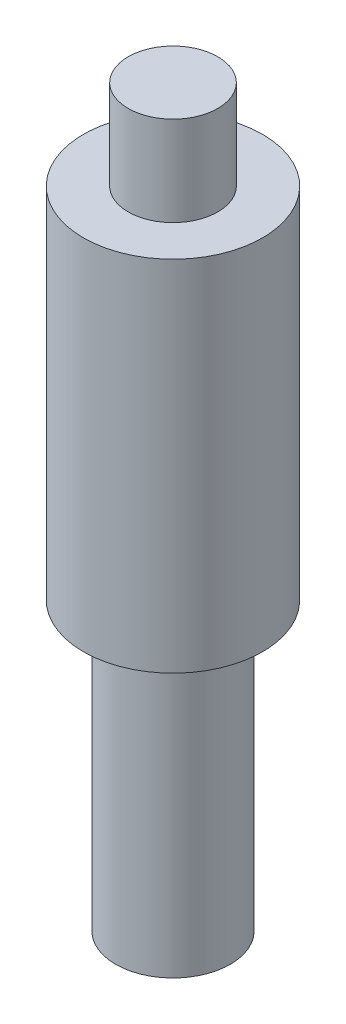
ISO-10303-21;
HEADER;
FILE_DESCRIPTION(('STEP AP214'),'2;1');
FILE_NAME('part.step','',(''),(''),'','','');
FILE_SCHEMA(('AUTOMOTIVE_DESIGN { 1 0 10303 214 1 1 1 1 }'));
ENDSEC;
DATA;
#1=APPLICATION_CONTEXT('core data for automotive mechanical design processes');
#2=APPLICATION_PROTOCOL_DEFINITION('international standard','automotive_design',2000,#1);
#3=PRODUCT_CONTEXT('',#1,'mechanical');
#4=PRODUCT('Part','Part','',(#3));
#5=PRODUCT_RELATED_PRODUCT_CATEGORY('part','',(#4));
#6=PRODUCT_DEFINITION_FORMATION('','',#4);
#7=PRODUCT_DEFINITION_CONTEXT('part definition',#1,'design');
#8=PRODUCT_DEFINITION('design','',#6,#7);
#9=PRODUCT_DEFINITION_SHAPE('','',#8);
#10=(LENGTH_UNIT() NAMED_UNIT(*) SI_UNIT(.MILLI.,.METRE.));
#11=(NAMED_UNIT(*) PLANE_ANGLE_UNIT() SI_UNIT($,.RADIAN.));
#12=(NAMED_UNIT(*) SI_UNIT($,.STERADIAN.) SOLID_ANGLE_UNIT());
#13=UNCERTAINTY_MEASURE_WITH_UNIT(LENGTH_MEASURE(1.E-05),#10,'distance_accuracy_value','');
#14=(GEOMETRIC_REPRESENTATION_CONTEXT(3) GLOBAL_UNCERTAINTY_ASSIGNED_CONTEXT((#13)) GLOBAL_UNIT_ASSIGNED_CONTEXT((#10,
#11,#12)) REPRESENTATION_CONTEXT('',''));
#15=CARTESIAN_POINT('',(0.,0.,0.));
#16=DIRECTION('',(0.,0.,1.));
#17=DIRECTION('',(1.,0.,0.));
#18=AXIS2_PLACEMENT_3D('',#15,#16,#17);
#19=CARTESIAN_POINT('',(0.,8.,0.));
#20=DIRECTION('',(0.,-1.,0.));
#21=DIRECTION('',(0.,0.,-1.));
#22=AXIS2_PLACEMENT_3D('',#19,#20,#21);
#23=CYLINDRICAL_SURFACE('',#22,1.6);
#24=CARTESIAN_POINT('',(0.,8.,0.));
#25=DIRECTION('',(0.,1.,0.));
#26=DIRECTION('',(0.,0.,1.));
#27=AXIS2_PLACEMENT_3D('',#24,#25,#26);
#28=CIRCLE('',#27,1.6);
#29=CARTESIAN_POINT('',(0.,8.,1.6));
#30=VERTEX_POINT('',#29);
#31=EDGE_CURVE('E51',#30,#30,#28,.T.);
#32=ORIENTED_EDGE('',*,*,#31,.F.);
#33=EDGE_LOOP('',(#32));
#34=FACE_BOUND('',#33,.T.);
#35=CARTESIAN_POINT('',(0.,0.,0.));
#36=DIRECTION('',(0.,1.,0.));
#37=DIRECTION('',(0.,0.,1.));
#38=AXIS2_PLACEMENT_3D('',#35,#36,#37);
#39=CIRCLE('',#38,1.6);
#40=CARTESIAN_POINT('',(0.,0.,1.6));
#41=VERTEX_POINT('',#40);
#42=EDGE_CURVE('E46',#41,#41,#39,.T.);
#43=ORIENTED_EDGE('',*,*,#42,.T.);
#44=EDGE_LOOP('',(#43));
#45=FACE_BOUND('',#44,.T.);
#46=ADVANCED_FACE('F43',(#34,#45),#23,.T.);
#47=CARTESIAN_POINT('',(0.,0.,0.));
#48=DIRECTION('',(0.,1.,0.));
#49=DIRECTION('',(0.,0.,1.));
#50=AXIS2_PLACEMENT_3D('',#47,#48,#49);
#51=PLANE('',#50);
#52=ORIENTED_EDGE('',*,*,#42,.F.);
#53=EDGE_LOOP('',(#52));
#54=FACE_BOUND('',#53,.T.);
#55=ADVANCED_FACE('F90',(#54),#51,.F.);
#56=CARTESIAN_POINT('',(0.,18.,0.));
#57=DIRECTION('',(0.,-1.,0.));
#58=DIRECTION('',(0.,0.,-1.));
#59=AXIS2_PLACEMENT_3D('',#56,#57,#58);
#60=CYLINDRICAL_SURFACE('',#59,2.5);
#61=CARTESIAN_POINT('',(0.,18.,0.));
#62=DIRECTION('',(0.,1.,0.));
#63=DIRECTION('',(0.,0.,1.));
#64=AXIS2_PLACEMENT_3D('',#61,#62,#63);
#65=CIRCLE('',#64,2.5);
#66=CARTESIAN_POINT('',(0.,18.,2.5));
#67=VERTEX_POINT('',#66);
#68=EDGE_CURVE('E60',#67,#67,#65,.T.);
#69=ORIENTED_EDGE('',*,*,#68,.F.);
#70=EDGE_LOOP('',(#69));
#71=FACE_BOUND('',#70,.T.);
#72=CARTESIAN_POINT('',(0.,8.,0.));
#73=DIRECTION('',(0.,1.,0.));
#74=DIRECTION('',(0.,0.,1.));
#75=AXIS2_PLACEMENT_3D('',#72,#73,#74);
#76=CIRCLE('',#75,2.5);
#77=CARTESIAN_POINT('',(0.,8.,2.5));
#78=VERTEX_POINT('',#77);
#79=EDGE_CURVE('E64',#78,#78,#76,.T.);
#80=ORIENTED_EDGE('',*,*,#79,.T.);
#81=EDGE_LOOP('',(#80));
#82=FACE_BOUND('',#81,.T.);
#83=ADVANCED_FACE('F95',(#71,#82),#60,.T.);
#84=CARTESIAN_POINT('',(0.,18.,0.));
#85=DIRECTION('',(0.,1.,0.));
#86=DIRECTION('',(0.,0.,1.));
#87=AXIS2_PLACEMENT_3D('',#84,#85,#86);
#88=PLANE('',#87);
#89=CARTESIAN_POINT('',(0.,18.,0.));
#90=DIRECTION('',(0.,1.,0.));
#91=DIRECTION('',(0.,0.,1.));
#92=AXIS2_PLACEMENT_3D('',#89,#90,#91);
#93=CIRCLE('',#92,1.25);
#94=CARTESIAN_POINT('',(0.,18.,1.25));
#95=VERTEX_POINT('',#94);
#96=EDGE_CURVE('E10',#95,#95,#93,.T.);
#97=ORIENTED_EDGE('',*,*,#96,.F.);
#98=EDGE_LOOP('',(#97));
#99=FACE_BOUND('',#98,.T.);
#100=ORIENTED_EDGE('',*,*,#68,.T.);
#101=EDGE_LOOP('',(#100));
#102=FACE_BOUND('',#101,.T.);
#103=ADVANCED_FACE('F85',(#99,#102),#88,.T.);
#104=CARTESIAN_POINT('',(0.,8.,0.));
#105=DIRECTION('',(0.,1.,0.));
#106=DIRECTION('',(0.,0.,1.));
#107=AXIS2_PLACEMENT_3D('',#104,#105,#106);
#108=PLANE('',#107);
#109=ORIENTED_EDGE('',*,*,#31,.T.);
#110=EDGE_LOOP('',(#109));
#111=FACE_BOUND('',#110,.T.);
#112=ORIENTED_EDGE('',*,*,#79,.F.);
#113=EDGE_LOOP('',(#112));
#114=FACE_BOUND('',#113,.T.);
#115=ADVANCED_FACE('F77',(#111,#114),#108,.F.);
#116=CARTESIAN_POINT('',(0.,20.5,0.));
#117=DIRECTION('',(0.,-1.,0.));
#118=DIRECTION('',(0.,0.,-1.));
#119=AXIS2_PLACEMENT_3D('',#116,#117,#118);
#120=CYLINDRICAL_SURFACE('',#119,1.25);
#121=CARTESIAN_POINT('',(0.,20.5,0.));
#122=DIRECTION('',(0.,1.,0.));
#123=DIRECTION('',(0.,0.,1.));
#124=AXIS2_PLACEMENT_3D('',#121,#122,#123);
#125=CIRCLE('',#124,1.25);
#126=CARTESIAN_POINT('',(0.,20.5,1.25));
#127=VERTEX_POINT('',#126);
#128=EDGE_CURVE('E59',#127,#127,#125,.T.);
#129=ORIENTED_EDGE('',*,*,#128,.F.);
#130=EDGE_LOOP('',(#129));
#131=FACE_BOUND('',#130,.T.);
#132=ORIENTED_EDGE('',*,*,#96,.T.);
#133=EDGE_LOOP('',(#132));
#134=FACE_BOUND('',#133,.T.);
#135=ADVANCED_FACE('F75',(#131,#134),#120,.T.);
#136=CARTESIAN_POINT('',(0.,20.5,0.));
#137=DIRECTION('',(0.,1.,0.));
#138=DIRECTION('',(0.,0.,1.));
#139=AXIS2_PLACEMENT_3D('',#136,#137,#138);
#140=PLANE('',#139);
#141=ORIENTED_EDGE('',*,*,#128,.T.);
#142=EDGE_LOOP('',(#141));
#143=FACE_BOUND('',#142,.T.);
#144=ADVANCED_FACE('F73',(#143),#140,.T.);
#145=CLOSED_SHELL('',(#46,#55,#83,#103,#115,#135,#144));
#146=MANIFOLD_SOLID_BREP('B2',#145);
#147=ADVANCED_BREP_SHAPE_REPRESENTATION('',(#18,#146),#14);
#148=SHAPE_DEFINITION_REPRESENTATION(#9,#147);
ENDSEC;
END-ISO-10303-21;
